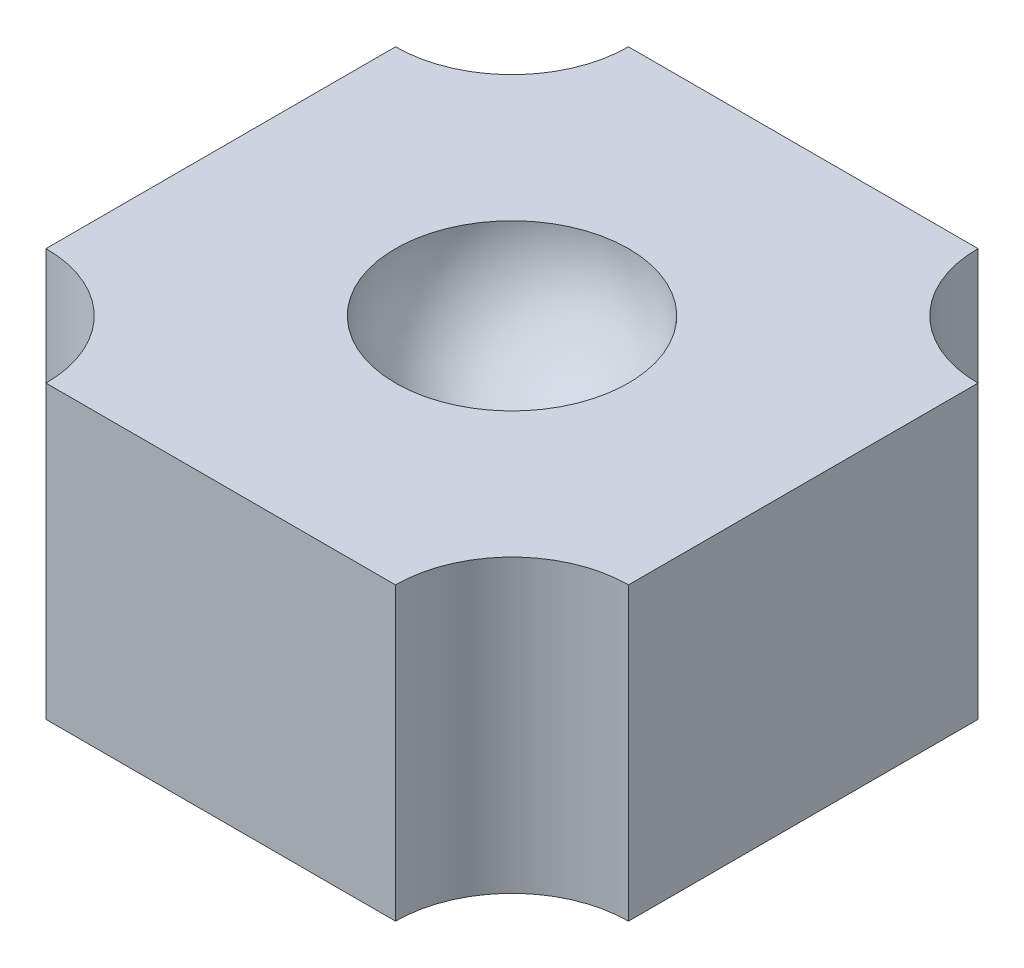
ISO-10303-21;
HEADER;
FILE_DESCRIPTION(('STEP AP214'),'2;1');
FILE_NAME('part.step','',(''),(''),'','','');
FILE_SCHEMA(('AUTOMOTIVE_DESIGN { 1 0 10303 214 1 1 1 1 }'));
ENDSEC;
DATA;
#1=APPLICATION_CONTEXT('core data for automotive mechanical design processes');
#2=APPLICATION_PROTOCOL_DEFINITION('international standard','automotive_design',2000,#1);
#3=PRODUCT_CONTEXT('',#1,'mechanical');
#4=PRODUCT('Part','Part','',(#3));
#5=PRODUCT_RELATED_PRODUCT_CATEGORY('part','',(#4));
#6=PRODUCT_DEFINITION_FORMATION('','',#4);
#7=PRODUCT_DEFINITION_CONTEXT('part definition',#1,'design');
#8=PRODUCT_DEFINITION('design','',#6,#7);
#9=PRODUCT_DEFINITION_SHAPE('','',#8);
#10=(LENGTH_UNIT() NAMED_UNIT(*) SI_UNIT(.MILLI.,.METRE.));
#11=(NAMED_UNIT(*) PLANE_ANGLE_UNIT() SI_UNIT($,.RADIAN.));
#12=(NAMED_UNIT(*) SI_UNIT($,.STERADIAN.) SOLID_ANGLE_UNIT());
#13=UNCERTAINTY_MEASURE_WITH_UNIT(LENGTH_MEASURE(1.E-05),#10,'distance_accuracy_value','');
#14=(GEOMETRIC_REPRESENTATION_CONTEXT(3) GLOBAL_UNCERTAINTY_ASSIGNED_CONTEXT((#13)) GLOBAL_UNIT_ASSIGNED_CONTEXT((#10,
#11,#12)) REPRESENTATION_CONTEXT('',''));
#15=CARTESIAN_POINT('',(0.,0.,0.));
#16=DIRECTION('',(0.,0.,1.));
#17=DIRECTION('',(1.,0.,0.));
#18=AXIS2_PLACEMENT_3D('',#15,#16,#17);
#19=CARTESIAN_POINT('',(25.,25.,-25.));
#20=DIRECTION('',(-1.,0.,0.));
#21=DIRECTION('',(0.,0.,1.));
#22=AXIS2_PLACEMENT_3D('',#19,#20,#21);
#23=PLANE('',#22);
#24=DIRECTION('',(0.,0.,-1.));
#25=VECTOR('',#24,1.);
#26=CARTESIAN_POINT('',(25.,25.,-25.));
#27=LINE('',#26,#25);
#28=CARTESIAN_POINT('',(25.,25.,15.));
#29=VERTEX_POINT('',#28);
#30=CARTESIAN_POINT('',(25.,25.,-15.));
#31=VERTEX_POINT('',#30);
#32=EDGE_CURVE('E304',#29,#31,#27,.T.);
#33=ORIENTED_EDGE('',*,*,#32,.F.);
#34=DIRECTION('',(0.,1.,0.));
#35=VECTOR('',#34,1.);
#36=CARTESIAN_POINT('',(25.,0.,15.));
#37=LINE('',#36,#35);
#38=CARTESIAN_POINT('',(25.,0.,15.));
#39=VERTEX_POINT('',#38);
#40=EDGE_CURVE('E300',#29,#39,#37,.F.);
#41=ORIENTED_EDGE('',*,*,#40,.T.);
#42=DIRECTION('',(0.,0.,-1.));
#43=VECTOR('',#42,1.);
#44=CARTESIAN_POINT('',(25.,0.,-25.));
#45=LINE('',#44,#43);
#46=CARTESIAN_POINT('',(25.,0.,-15.));
#47=VERTEX_POINT('',#46);
#48=EDGE_CURVE('E303',#39,#47,#45,.T.);
#49=ORIENTED_EDGE('',*,*,#48,.T.);
#50=DIRECTION('',(0.,1.,0.));
#51=VECTOR('',#50,1.);
#52=CARTESIAN_POINT('',(25.,0.,-15.));
#53=LINE('',#52,#51);
#54=EDGE_CURVE('E294',#47,#31,#53,.T.);
#55=ORIENTED_EDGE('',*,*,#54,.T.);
#56=EDGE_LOOP('',(#33,#41,#49,#55));
#57=FACE_BOUND('',#56,.T.);
#58=ADVANCED_FACE('F33',(#57),#23,.F.);
#59=CARTESIAN_POINT('',(-25.,25.,-25.));
#60=DIRECTION('',(0.,0.,1.));
#61=DIRECTION('',(1.,0.,0.));
#62=AXIS2_PLACEMENT_3D('',#59,#60,#61);
#63=PLANE('',#62);
#64=DIRECTION('',(-1.,0.,0.));
#65=VECTOR('',#64,1.);
#66=CARTESIAN_POINT('',(-25.,25.,-25.));
#67=LINE('',#66,#65);
#68=CARTESIAN_POINT('',(15.,25.,-25.));
#69=VERTEX_POINT('',#68);
#70=CARTESIAN_POINT('',(-15.,25.,-25.));
#71=VERTEX_POINT('',#70);
#72=EDGE_CURVE('E307',#69,#71,#67,.T.);
#73=ORIENTED_EDGE('',*,*,#72,.F.);
#74=DIRECTION('',(0.,1.,0.));
#75=VECTOR('',#74,1.);
#76=CARTESIAN_POINT('',(15.,0.,-25.));
#77=LINE('',#76,#75);
#78=CARTESIAN_POINT('',(15.,0.,-25.));
#79=VERTEX_POINT('',#78);
#80=EDGE_CURVE('E291',#69,#79,#77,.F.);
#81=ORIENTED_EDGE('',*,*,#80,.T.);
#82=DIRECTION('',(-1.,0.,0.));
#83=VECTOR('',#82,1.);
#84=CARTESIAN_POINT('',(-25.,0.,-25.));
#85=LINE('',#84,#83);
#86=CARTESIAN_POINT('',(-15.,0.,-25.));
#87=VERTEX_POINT('',#86);
#88=EDGE_CURVE('E319',#79,#87,#85,.T.);
#89=ORIENTED_EDGE('',*,*,#88,.T.);
#90=DIRECTION('',(0.,1.,0.));
#91=VECTOR('',#90,1.);
#92=CARTESIAN_POINT('',(-15.,0.,-25.));
#93=LINE('',#92,#91);
#94=EDGE_CURVE('E288',#87,#71,#93,.T.);
#95=ORIENTED_EDGE('',*,*,#94,.T.);
#96=EDGE_LOOP('',(#73,#81,#89,#95));
#97=FACE_BOUND('',#96,.T.);
#98=ADVANCED_FACE('F351',(#97),#63,.F.);
#99=CARTESIAN_POINT('',(-25.,25.,-25.));
#100=DIRECTION('',(1.,0.,0.));
#101=DIRECTION('',(0.,0.,-1.));
#102=AXIS2_PLACEMENT_3D('',#99,#100,#101);
#103=PLANE('',#102);
#104=DIRECTION('',(0.,0.,1.));
#105=VECTOR('',#104,1.);
#106=CARTESIAN_POINT('',(-25.,25.,-25.));
#107=LINE('',#106,#105);
#108=CARTESIAN_POINT('',(-25.,25.,-15.));
#109=VERTEX_POINT('',#108);
#110=CARTESIAN_POINT('',(-25.,25.,15.));
#111=VERTEX_POINT('',#110);
#112=EDGE_CURVE('E311',#109,#111,#107,.T.);
#113=ORIENTED_EDGE('',*,*,#112,.F.);
#114=DIRECTION('',(0.,1.,0.));
#115=VECTOR('',#114,1.);
#116=CARTESIAN_POINT('',(-25.,0.,-15.));
#117=LINE('',#116,#115);
#118=CARTESIAN_POINT('',(-25.,0.,-15.));
#119=VERTEX_POINT('',#118);
#120=EDGE_CURVE('E285',#109,#119,#117,.F.);
#121=ORIENTED_EDGE('',*,*,#120,.T.);
#122=DIRECTION('',(0.,0.,1.));
#123=VECTOR('',#122,1.);
#124=CARTESIAN_POINT('',(-25.,0.,-25.));
#125=LINE('',#124,#123);
#126=CARTESIAN_POINT('',(-25.,0.,15.));
#127=VERTEX_POINT('',#126);
#128=EDGE_CURVE('E322',#119,#127,#125,.T.);
#129=ORIENTED_EDGE('',*,*,#128,.T.);
#130=DIRECTION('',(0.,1.,0.));
#131=VECTOR('',#130,1.);
#132=CARTESIAN_POINT('',(-25.,0.,15.));
#133=LINE('',#132,#131);
#134=EDGE_CURVE('E282',#127,#111,#133,.T.);
#135=ORIENTED_EDGE('',*,*,#134,.T.);
#136=EDGE_LOOP('',(#113,#121,#129,#135));
#137=FACE_BOUND('',#136,.T.);
#138=ADVANCED_FACE('F356',(#137),#103,.F.);
#139=CARTESIAN_POINT('',(-25.,25.,25.));
#140=DIRECTION('',(0.,0.,-1.));
#141=DIRECTION('',(-1.,0.,0.));
#142=AXIS2_PLACEMENT_3D('',#139,#140,#141);
#143=PLANE('',#142);
#144=DIRECTION('',(1.,0.,0.));
#145=VECTOR('',#144,1.);
#146=CARTESIAN_POINT('',(-25.,0.,25.));
#147=LINE('',#146,#145);
#148=CARTESIAN_POINT('',(-15.,0.,25.));
#149=VERTEX_POINT('',#148);
#150=CARTESIAN_POINT('',(15.,0.,25.));
#151=VERTEX_POINT('',#150);
#152=EDGE_CURVE('E308',#149,#151,#147,.T.);
#153=ORIENTED_EDGE('',*,*,#152,.T.);
#154=DIRECTION('',(0.,1.,0.));
#155=VECTOR('',#154,1.);
#156=CARTESIAN_POINT('',(15.,0.,25.));
#157=LINE('',#156,#155);
#158=CARTESIAN_POINT('',(15.,25.,25.));
#159=VERTEX_POINT('',#158);
#160=EDGE_CURVE('E297',#151,#159,#157,.T.);
#161=ORIENTED_EDGE('',*,*,#160,.T.);
#162=DIRECTION('',(1.,0.,0.));
#163=VECTOR('',#162,1.);
#164=CARTESIAN_POINT('',(-25.,25.,25.));
#165=LINE('',#164,#163);
#166=CARTESIAN_POINT('',(-15.,25.,25.));
#167=VERTEX_POINT('',#166);
#168=EDGE_CURVE('E314',#167,#159,#165,.T.);
#169=ORIENTED_EDGE('',*,*,#168,.F.);
#170=DIRECTION('',(0.,1.,0.));
#171=VECTOR('',#170,1.);
#172=CARTESIAN_POINT('',(-15.,0.,25.));
#173=LINE('',#172,#171);
#174=EDGE_CURVE('E278',#167,#149,#173,.F.);
#175=ORIENTED_EDGE('',*,*,#174,.T.);
#176=EDGE_LOOP('',(#153,#161,#169,#175));
#177=FACE_BOUND('',#176,.T.);
#178=ADVANCED_FACE('F366',(#177),#143,.F.);
#179=CARTESIAN_POINT('',(0.,25.,0.));
#180=DIRECTION('',(0.,1.,0.));
#181=DIRECTION('',(0.,0.,1.));
#182=AXIS2_PLACEMENT_3D('',#179,#180,#181);
#183=PLANE('',#182);
#184=CARTESIAN_POINT('',(0.,25.,0.));
#185=DIRECTION('',(0.,1.,0.));
#186=DIRECTION('',(0.,0.,1.));
#187=AXIS2_PLACEMENT_3D('',#184,#185,#186);
#188=CIRCLE('',#187,10.);
#189=CARTESIAN_POINT('',(0.,25.,10.));
#190=VERTEX_POINT('',#189);
#191=EDGE_CURVE('E256',#190,#190,#188,.F.);
#192=ORIENTED_EDGE('',*,*,#191,.T.);
#193=EDGE_LOOP('',(#192));
#194=FACE_BOUND('',#193,.T.);
#195=CARTESIAN_POINT('',(25.,25.,25.));
#196=DIRECTION('',(0.,1.,0.));
#197=DIRECTION('',(0.,0.,1.));
#198=AXIS2_PLACEMENT_3D('',#195,#196,#197);
#199=CIRCLE('',#198,10.);
#200=EDGE_CURVE('E273',#29,#159,#199,.T.);
#201=ORIENTED_EDGE('',*,*,#200,.F.);
#202=ORIENTED_EDGE('',*,*,#32,.T.);
#203=CARTESIAN_POINT('',(25.,25.,-25.));
#204=DIRECTION('',(0.,1.,0.));
#205=DIRECTION('',(0.,0.,1.));
#206=AXIS2_PLACEMENT_3D('',#203,#204,#205);
#207=CIRCLE('',#206,10.);
#208=EDGE_CURVE('E268',#69,#31,#207,.T.);
#209=ORIENTED_EDGE('',*,*,#208,.F.);
#210=ORIENTED_EDGE('',*,*,#72,.T.);
#211=CARTESIAN_POINT('',(-25.,25.,-25.));
#212=DIRECTION('',(0.,1.,0.));
#213=DIRECTION('',(0.,0.,1.));
#214=AXIS2_PLACEMENT_3D('',#211,#212,#213);
#215=CIRCLE('',#214,10.);
#216=EDGE_CURVE('E266',#109,#71,#215,.T.);
#217=ORIENTED_EDGE('',*,*,#216,.F.);
#218=ORIENTED_EDGE('',*,*,#112,.T.);
#219=CARTESIAN_POINT('',(-25.,25.,25.));
#220=DIRECTION('',(0.,1.,0.));
#221=DIRECTION('',(0.,0.,1.));
#222=AXIS2_PLACEMENT_3D('',#219,#220,#221);
#223=CIRCLE('',#222,10.);
#224=EDGE_CURVE('E265',#167,#111,#223,.T.);
#225=ORIENTED_EDGE('',*,*,#224,.F.);
#226=ORIENTED_EDGE('',*,*,#168,.T.);
#227=EDGE_LOOP('',(#201,#202,#209,#210,#217,#218,#225,#226));
#228=FACE_BOUND('',#227,.T.);
#229=ADVANCED_FACE('F331',(#194,#228),#183,.T.);
#230=CARTESIAN_POINT('',(0.,0.,0.));
#231=DIRECTION('',(0.,1.,0.));
#232=DIRECTION('',(0.,0.,1.));
#233=AXIS2_PLACEMENT_3D('',#230,#231,#232);
#234=PLANE('',#233);
#235=DIRECTION('',(0.,0.,1.));
#236=VECTOR('',#235,1.);
#237=CARTESIAN_POINT('',(2.5,0.,0.));
#238=LINE('',#237,#236);
#239=CARTESIAN_POINT('',(2.5,0.,0.));
#240=VERTEX_POINT('',#239);
#241=CARTESIAN_POINT('',(2.5,0.,7.66987298107781));
#242=VERTEX_POINT('',#241);
#243=EDGE_CURVE('E247',#240,#242,#238,.T.);
#244=ORIENTED_EDGE('',*,*,#243,.F.);
#245=CARTESIAN_POINT('',(0.,0.,0.));
#246=DIRECTION('',(0.,-1.,0.));
#247=DIRECTION('',(0.,0.,-1.));
#248=AXIS2_PLACEMENT_3D('',#245,#246,#247);
#249=CIRCLE('',#248,2.5);
#250=CARTESIAN_POINT('',(-2.5,0.,0.));
#251=VERTEX_POINT('',#250);
#252=EDGE_CURVE('E245',#251,#240,#249,.T.);
#253=ORIENTED_EDGE('',*,*,#252,.F.);
#254=DIRECTION('',(0.,0.,-1.));
#255=VECTOR('',#254,1.);
#256=CARTESIAN_POINT('',(-2.5,0.,0.));
#257=LINE('',#256,#255);
#258=CARTESIAN_POINT('',(-2.5,0.,7.66987298107781));
#259=VERTEX_POINT('',#258);
#260=EDGE_CURVE('E244',#259,#251,#257,.T.);
#261=ORIENTED_EDGE('',*,*,#260,.F.);
#262=CARTESIAN_POINT('',(0.,0.,12.));
#263=DIRECTION('',(0.,-1.,0.));
#264=DIRECTION('',(0.,0.,-1.));
#265=AXIS2_PLACEMENT_3D('',#262,#263,#264);
#266=CIRCLE('',#265,5.);
#267=EDGE_CURVE('E249',#242,#259,#266,.T.);
#268=ORIENTED_EDGE('',*,*,#267,.F.);
#269=EDGE_LOOP('',(#244,#253,#261,#268));
#270=FACE_BOUND('',#269,.T.);
#271=ORIENTED_EDGE('',*,*,#48,.F.);
#272=CARTESIAN_POINT('',(25.,0.,25.));
#273=DIRECTION('',(0.,1.,0.));
#274=DIRECTION('',(0.,0.,1.));
#275=AXIS2_PLACEMENT_3D('',#272,#273,#274);
#276=CIRCLE('',#275,10.);
#277=EDGE_CURVE('E270',#39,#151,#276,.T.);
#278=ORIENTED_EDGE('',*,*,#277,.T.);
#279=ORIENTED_EDGE('',*,*,#152,.F.);
#280=CARTESIAN_POINT('',(-25.,0.,25.));
#281=DIRECTION('',(0.,1.,0.));
#282=DIRECTION('',(0.,0.,1.));
#283=AXIS2_PLACEMENT_3D('',#280,#281,#282);
#284=CIRCLE('',#283,10.);
#285=EDGE_CURVE('E275',#149,#127,#284,.T.);
#286=ORIENTED_EDGE('',*,*,#285,.T.);
#287=ORIENTED_EDGE('',*,*,#128,.F.);
#288=CARTESIAN_POINT('',(-25.,0.,-25.));
#289=DIRECTION('',(0.,1.,0.));
#290=DIRECTION('',(0.,0.,1.));
#291=AXIS2_PLACEMENT_3D('',#288,#289,#290);
#292=CIRCLE('',#291,10.);
#293=EDGE_CURVE('E262',#119,#87,#292,.T.);
#294=ORIENTED_EDGE('',*,*,#293,.T.);
#295=ORIENTED_EDGE('',*,*,#88,.F.);
#296=CARTESIAN_POINT('',(25.,0.,-25.));
#297=DIRECTION('',(0.,1.,0.));
#298=DIRECTION('',(0.,0.,1.));
#299=AXIS2_PLACEMENT_3D('',#296,#297,#298);
#300=CIRCLE('',#299,10.);
#301=EDGE_CURVE('E40',#79,#47,#300,.T.);
#302=ORIENTED_EDGE('',*,*,#301,.T.);
#303=EDGE_LOOP('',(#271,#278,#279,#286,#287,#294,#295,#302));
#304=FACE_BOUND('',#303,.T.);
#305=ADVANCED_FACE('F369',(#270,#304),#234,.F.);
#306=CARTESIAN_POINT('',(-25.,0.,25.));
#307=DIRECTION('',(0.,1.,0.));
#308=DIRECTION('',(0.,0.,1.));
#309=AXIS2_PLACEMENT_3D('',#306,#307,#308);
#310=CYLINDRICAL_SURFACE('',#309,10.);
#311=ORIENTED_EDGE('',*,*,#285,.F.);
#312=ORIENTED_EDGE('',*,*,#174,.F.);
#313=ORIENTED_EDGE('',*,*,#224,.T.);
#314=ORIENTED_EDGE('',*,*,#134,.F.);
#315=EDGE_LOOP('',(#311,#312,#313,#314));
#316=FACE_BOUND('',#315,.T.);
#317=ADVANCED_FACE('F378',(#316),#310,.F.);
#318=CARTESIAN_POINT('',(-25.,0.,-25.));
#319=DIRECTION('',(0.,1.,0.));
#320=DIRECTION('',(0.,0.,1.));
#321=AXIS2_PLACEMENT_3D('',#318,#319,#320);
#322=CYLINDRICAL_SURFACE('',#321,10.);
#323=ORIENTED_EDGE('',*,*,#293,.F.);
#324=ORIENTED_EDGE('',*,*,#120,.F.);
#325=ORIENTED_EDGE('',*,*,#216,.T.);
#326=ORIENTED_EDGE('',*,*,#94,.F.);
#327=EDGE_LOOP('',(#323,#324,#325,#326));
#328=FACE_BOUND('',#327,.T.);
#329=ADVANCED_FACE('F380',(#328),#322,.F.);
#330=CARTESIAN_POINT('',(25.,0.,-25.));
#331=DIRECTION('',(0.,1.,0.));
#332=DIRECTION('',(0.,0.,1.));
#333=AXIS2_PLACEMENT_3D('',#330,#331,#332);
#334=CYLINDRICAL_SURFACE('',#333,10.);
#335=ORIENTED_EDGE('',*,*,#301,.F.);
#336=ORIENTED_EDGE('',*,*,#80,.F.);
#337=ORIENTED_EDGE('',*,*,#208,.T.);
#338=ORIENTED_EDGE('',*,*,#54,.F.);
#339=EDGE_LOOP('',(#335,#336,#337,#338));
#340=FACE_BOUND('',#339,.T.);
#341=ADVANCED_FACE('F346',(#340),#334,.F.);
#342=CARTESIAN_POINT('',(25.,0.,25.));
#343=DIRECTION('',(0.,1.,0.));
#344=DIRECTION('',(0.,0.,1.));
#345=AXIS2_PLACEMENT_3D('',#342,#343,#344);
#346=CYLINDRICAL_SURFACE('',#345,10.);
#347=ORIENTED_EDGE('',*,*,#200,.T.);
#348=ORIENTED_EDGE('',*,*,#160,.F.);
#349=ORIENTED_EDGE('',*,*,#277,.F.);
#350=ORIENTED_EDGE('',*,*,#40,.F.);
#351=EDGE_LOOP('',(#347,#348,#349,#350));
#352=FACE_BOUND('',#351,.T.);
#353=ADVANCED_FACE('F337',(#352),#346,.F.);
#354=CARTESIAN_POINT('',(0.,25.,0.));
#355=DIRECTION('',(0.,0.,1.));
#356=DIRECTION('',(1.,0.,0.));
#357=AXIS2_PLACEMENT_3D('',#354,#355,#356);
#358=SPHERICAL_SURFACE('',#357,10.);
#359=CARTESIAN_POINT('',(0.,25.,0.));
#360=DIRECTION('',(0.,1.,0.));
#361=DIRECTION('',(0.,0.,1.));
#362=AXIS2_PLACEMENT_3D('',#359,#360,#361);
#363=SPHERICAL_SURFACE('',#362,10.);
#364=ORIENTED_EDGE('',*,*,#191,.F.);
#365=EDGE_LOOP('',(#364));
#366=FACE_BOUND('',#365,.T.);
#367=ADVANCED_FACE('F334',(#366),#363,.F.);
#368=CARTESIAN_POINT('',(0.,8.6,0.));
#369=DIRECTION('',(0.,-1.,0.));
#370=DIRECTION('',(0.,0.,-1.));
#371=AXIS2_PLACEMENT_3D('',#368,#369,#370);
#372=CYLINDRICAL_SURFACE('',#371,2.5);
#373=DIRECTION('',(0.,-1.,0.));
#374=VECTOR('',#373,1.);
#375=CARTESIAN_POINT('',(2.5,8.6,0.));
#376=LINE('',#375,#374);
#377=CARTESIAN_POINT('',(2.5,4.9,0.));
#378=VERTEX_POINT('',#377);
#379=EDGE_CURVE('E54',#378,#240,#376,.T.);
#380=ORIENTED_EDGE('',*,*,#379,.F.);
#381=CARTESIAN_POINT('',(0.,4.9,0.));
#382=DIRECTION('',(0.,-1.,0.));
#383=DIRECTION('',(1.,0.,0.));
#384=AXIS2_PLACEMENT_3D('',#381,#382,#383);
#385=CIRCLE('',#384,2.5);
#386=CARTESIAN_POINT('',(-2.5,4.9,0.));
#387=VERTEX_POINT('',#386);
#388=EDGE_CURVE('E232',#378,#387,#385,.F.);
#389=ORIENTED_EDGE('',*,*,#388,.T.);
#390=DIRECTION('',(0.,-1.,0.));
#391=VECTOR('',#390,1.);
#392=CARTESIAN_POINT('',(-2.5,8.6,0.));
#393=LINE('',#392,#391);
#394=EDGE_CURVE('E254',#387,#251,#393,.T.);
#395=ORIENTED_EDGE('',*,*,#394,.T.);
#396=ORIENTED_EDGE('',*,*,#252,.T.);
#397=EDGE_LOOP('',(#380,#389,#395,#396));
#398=FACE_BOUND('',#397,.T.);
#399=ADVANCED_FACE('F336',(#398),#372,.F.);
#400=CARTESIAN_POINT('',(-2.5,8.6,0.));
#401=DIRECTION('',(-1.,0.,0.));
#402=DIRECTION('',(0.,0.,1.));
#403=AXIS2_PLACEMENT_3D('',#400,#401,#402);
#404=PLANE('',#403);
#405=ORIENTED_EDGE('',*,*,#394,.F.);
#406=DIRECTION('',(0.,0.,1.));
#407=VECTOR('',#406,1.);
#408=CARTESIAN_POINT('',(-2.5,4.9,0.));
#409=LINE('',#408,#407);
#410=CARTESIAN_POINT('',(-2.5,4.9,7.66987298107781));
#411=VERTEX_POINT('',#410);
#412=EDGE_CURVE('E237',#387,#411,#409,.T.);
#413=ORIENTED_EDGE('',*,*,#412,.T.);
#414=DIRECTION('',(0.,-1.,0.));
#415=VECTOR('',#414,1.);
#416=CARTESIAN_POINT('',(-2.5,8.6,7.66987298107781));
#417=LINE('',#416,#415);
#418=EDGE_CURVE('E257',#411,#259,#417,.T.);
#419=ORIENTED_EDGE('',*,*,#418,.T.);
#420=ORIENTED_EDGE('',*,*,#260,.T.);
#421=EDGE_LOOP('',(#405,#413,#419,#420));
#422=FACE_BOUND('',#421,.T.);
#423=ADVANCED_FACE('F343',(#422),#404,.F.);
#424=CARTESIAN_POINT('',(0.,8.6,12.));
#425=DIRECTION('',(0.,-1.,0.));
#426=DIRECTION('',(0.,0.,-1.));
#427=AXIS2_PLACEMENT_3D('',#424,#425,#426);
#428=CYLINDRICAL_SURFACE('',#427,5.);
#429=ORIENTED_EDGE('',*,*,#418,.F.);
#430=CARTESIAN_POINT('',(0.,4.9,12.));
#431=DIRECTION('',(0.,-1.,0.));
#432=DIRECTION('',(1.,0.,0.));
#433=AXIS2_PLACEMENT_3D('',#430,#431,#432);
#434=CIRCLE('',#433,5.);
#435=CARTESIAN_POINT('',(-4.,4.9,9.));
#436=VERTEX_POINT('',#435);
#437=EDGE_CURVE('E234',#411,#436,#434,.F.);
#438=ORIENTED_EDGE('',*,*,#437,.T.);
#439=DIRECTION('',(0.,-1.,0.));
#440=VECTOR('',#439,1.);
#441=CARTESIAN_POINT('',(-4.,8.6,9.));
#442=LINE('',#441,#440);
#443=CARTESIAN_POINT('',(-4.,8.6,9.));
#444=VERTEX_POINT('',#443);
#445=EDGE_CURVE('E228',#436,#444,#442,.F.);
#446=ORIENTED_EDGE('',*,*,#445,.T.);
#447=CARTESIAN_POINT('',(0.,8.6,12.));
#448=DIRECTION('',(0.,-1.,0.));
#449=DIRECTION('',(0.,0.,-1.));
#450=AXIS2_PLACEMENT_3D('',#447,#448,#449);
#451=CIRCLE('',#450,5.);
#452=CARTESIAN_POINT('',(-4.,8.6,15.));
#453=VERTEX_POINT('',#452);
#454=EDGE_CURVE('E240',#453,#444,#451,.T.);
#455=ORIENTED_EDGE('',*,*,#454,.F.);
#456=DIRECTION('',(0.,-1.,0.));
#457=VECTOR('',#456,1.);
#458=CARTESIAN_POINT('',(-4.,8.6,15.));
#459=LINE('',#458,#457);
#460=CARTESIAN_POINT('',(-4.,4.9,15.));
#461=VERTEX_POINT('',#460);
#462=EDGE_CURVE('E225',#453,#461,#459,.T.);
#463=ORIENTED_EDGE('',*,*,#462,.T.);
#464=CARTESIAN_POINT('',(0.,4.9,17.));
#465=VERTEX_POINT('',#464);
#466=EDGE_CURVE('E233',#461,#465,#434,.F.);
#467=ORIENTED_EDGE('',*,*,#466,.T.);
#468=CARTESIAN_POINT('',(4.,4.9,15.));
#469=VERTEX_POINT('',#468);
#470=EDGE_CURVE('E558',#465,#469,#434,.F.);
#471=ORIENTED_EDGE('',*,*,#470,.T.);
#472=DIRECTION('',(0.,-1.,0.));
#473=VECTOR('',#472,1.);
#474=CARTESIAN_POINT('',(4.,8.6,15.));
#475=LINE('',#474,#473);
#476=CARTESIAN_POINT('',(4.,8.6,15.));
#477=VERTEX_POINT('',#476);
#478=EDGE_CURVE('E223',#469,#477,#475,.F.);
#479=ORIENTED_EDGE('',*,*,#478,.T.);
#480=CARTESIAN_POINT('',(4.,8.6,9.));
#481=VERTEX_POINT('',#480);
#482=EDGE_CURVE('E243',#481,#477,#451,.T.);
#483=ORIENTED_EDGE('',*,*,#482,.F.);
#484=DIRECTION('',(0.,-1.,0.));
#485=VECTOR('',#484,1.);
#486=CARTESIAN_POINT('',(4.,8.6,9.));
#487=LINE('',#486,#485);
#488=CARTESIAN_POINT('',(4.,4.9,9.));
#489=VERTEX_POINT('',#488);
#490=EDGE_CURVE('E216',#481,#489,#487,.T.);
#491=ORIENTED_EDGE('',*,*,#490,.T.);
#492=CARTESIAN_POINT('',(2.5,4.9,7.66987298107781));
#493=VERTEX_POINT('',#492);
#494=EDGE_CURVE('E180',#489,#493,#434,.F.);
#495=ORIENTED_EDGE('',*,*,#494,.T.);
#496=DIRECTION('',(0.,-1.,0.));
#497=VECTOR('',#496,1.);
#498=CARTESIAN_POINT('',(2.5,8.6,7.66987298107781));
#499=LINE('',#498,#497);
#500=EDGE_CURVE('E259',#493,#242,#499,.T.);
#501=ORIENTED_EDGE('',*,*,#500,.T.);
#502=ORIENTED_EDGE('',*,*,#267,.T.);
#503=EDGE_LOOP('',(#429,#438,#446,#455,#463,#467,#471,#479,#483,#491,#495,#501,#502));
#504=FACE_BOUND('',#503,.T.);
#505=ADVANCED_FACE('F430',(#504),#428,.F.);
#506=CARTESIAN_POINT('',(2.5,8.6,0.));
#507=DIRECTION('',(1.,0.,0.));
#508=DIRECTION('',(0.,0.,-1.));
#509=AXIS2_PLACEMENT_3D('',#506,#507,#508);
#510=PLANE('',#509);
#511=ORIENTED_EDGE('',*,*,#500,.F.);
#512=DIRECTION('',(0.,0.,-1.));
#513=VECTOR('',#512,1.);
#514=CARTESIAN_POINT('',(2.5,4.9,0.));
#515=LINE('',#514,#513);
#516=EDGE_CURVE('E11',#493,#378,#515,.T.);
#517=ORIENTED_EDGE('',*,*,#516,.T.);
#518=ORIENTED_EDGE('',*,*,#379,.T.);
#519=ORIENTED_EDGE('',*,*,#243,.T.);
#520=EDGE_LOOP('',(#511,#517,#518,#519));
#521=FACE_BOUND('',#520,.T.);
#522=ADVANCED_FACE('F440',(#521),#510,.F.);
#523=CARTESIAN_POINT('',(0.,8.6,0.));
#524=DIRECTION('',(0.,-1.,0.));
#525=DIRECTION('',(0.,0.,-1.));
#526=AXIS2_PLACEMENT_3D('',#523,#524,#525);
#527=PLANE('',#526);
#528=DIRECTION('',(0.,0.,1.));
#529=VECTOR('',#528,1.);
#530=CARTESIAN_POINT('',(4.,8.6,-7.));
#531=LINE('',#530,#529);
#532=CARTESIAN_POINT('',(4.,8.6,-7.));
#533=VERTEX_POINT('',#532);
#534=EDGE_CURVE('E189',#533,#481,#531,.T.);
#535=ORIENTED_EDGE('',*,*,#534,.T.);
#536=ORIENTED_EDGE('',*,*,#482,.T.);
#537=CARTESIAN_POINT('',(4.,8.6,17.));
#538=VERTEX_POINT('',#537);
#539=EDGE_CURVE('E47',#477,#538,#531,.T.);
#540=ORIENTED_EDGE('',*,*,#539,.T.);
#541=DIRECTION('',(-1.,0.,0.));
#542=VECTOR('',#541,1.);
#543=CARTESIAN_POINT('',(-4.,8.6,17.));
#544=LINE('',#543,#542);
#545=CARTESIAN_POINT('',(-4.,8.6,17.));
#546=VERTEX_POINT('',#545);
#547=EDGE_CURVE('E209',#538,#546,#544,.T.);
#548=ORIENTED_EDGE('',*,*,#547,.T.);
#549=DIRECTION('',(0.,0.,1.));
#550=VECTOR('',#549,1.);
#551=CARTESIAN_POINT('',(-4.,8.6,-7.));
#552=LINE('',#551,#550);
#553=EDGE_CURVE('E220',#453,#546,#552,.T.);
#554=ORIENTED_EDGE('',*,*,#553,.F.);
#555=ORIENTED_EDGE('',*,*,#454,.T.);
#556=CARTESIAN_POINT('',(-4.,8.6,-7.));
#557=VERTEX_POINT('',#556);
#558=EDGE_CURVE('E218',#557,#444,#552,.T.);
#559=ORIENTED_EDGE('',*,*,#558,.F.);
#560=DIRECTION('',(-1.,0.,0.));
#561=VECTOR('',#560,1.);
#562=CARTESIAN_POINT('',(-4.,8.6,-7.));
#563=LINE('',#562,#561);
#564=EDGE_CURVE('E193',#533,#557,#563,.T.);
#565=ORIENTED_EDGE('',*,*,#564,.F.);
#566=EDGE_LOOP('',(#535,#536,#540,#548,#554,#555,#559,#565));
#567=FACE_BOUND('',#566,.T.);
#568=ADVANCED_FACE('F450',(#567),#527,.T.);
#569=CARTESIAN_POINT('',(0.,0.,-7.));
#570=DIRECTION('',(0.,0.,-1.));
#571=DIRECTION('',(-1.,0.,0.));
#572=AXIS2_PLACEMENT_3D('',#569,#570,#571);
#573=PLANE('',#572);
#574=DIRECTION('',(1.,0.,0.));
#575=VECTOR('',#574,1.);
#576=CARTESIAN_POINT('',(0.,4.9,-7.));
#577=LINE('',#576,#575);
#578=CARTESIAN_POINT('',(-4.,4.9,-7.));
#579=VERTEX_POINT('',#578);
#580=CARTESIAN_POINT('',(4.,4.9,-7.));
#581=VERTEX_POINT('',#580);
#582=EDGE_CURVE('E177',#579,#581,#577,.T.);
#583=ORIENTED_EDGE('',*,*,#582,.T.);
#584=DIRECTION('',(0.,1.,0.));
#585=VECTOR('',#584,1.);
#586=CARTESIAN_POINT('',(4.,8.6,-7.));
#587=LINE('',#586,#585);
#588=EDGE_CURVE('E186',#581,#533,#587,.T.);
#589=ORIENTED_EDGE('',*,*,#588,.T.);
#590=ORIENTED_EDGE('',*,*,#564,.T.);
#591=DIRECTION('',(0.,-1.,0.));
#592=VECTOR('',#591,1.);
#593=CARTESIAN_POINT('',(-4.,4.9,-7.));
#594=LINE('',#593,#592);
#595=EDGE_CURVE('E198',#557,#579,#594,.T.);
#596=ORIENTED_EDGE('',*,*,#595,.T.);
#597=EDGE_LOOP('',(#583,#589,#590,#596));
#598=FACE_BOUND('',#597,.T.);
#599=ADVANCED_FACE('F196',(#598),#573,.F.);
#600=CARTESIAN_POINT('',(0.,4.9,-7.));
#601=DIRECTION('',(0.,-1.,0.));
#602=DIRECTION('',(1.,0.,0.));
#603=AXIS2_PLACEMENT_3D('',#600,#601,#602);
#604=PLANE('',#603);
#605=ORIENTED_EDGE('',*,*,#412,.F.);
#606=ORIENTED_EDGE('',*,*,#388,.F.);
#607=ORIENTED_EDGE('',*,*,#516,.F.);
#608=ORIENTED_EDGE('',*,*,#494,.F.);
#609=DIRECTION('',(0.,0.,1.));
#610=VECTOR('',#609,1.);
#611=CARTESIAN_POINT('',(4.,4.9,-7.));
#612=LINE('',#611,#610);
#613=EDGE_CURVE('E172',#581,#489,#612,.T.);
#614=ORIENTED_EDGE('',*,*,#613,.F.);
#615=ORIENTED_EDGE('',*,*,#582,.F.);
#616=DIRECTION('',(0.,0.,1.));
#617=VECTOR('',#616,1.);
#618=CARTESIAN_POINT('',(-4.,4.9,-7.));
#619=LINE('',#618,#617);
#620=EDGE_CURVE('E214',#579,#436,#619,.T.);
#621=ORIENTED_EDGE('',*,*,#620,.T.);
#622=ORIENTED_EDGE('',*,*,#437,.F.);
#623=EDGE_LOOP('',(#605,#606,#607,#608,#614,#615,#621,#622));
#624=FACE_BOUND('',#623,.T.);
#625=ADVANCED_FACE('F174',(#624),#604,.F.);
#626=CARTESIAN_POINT('',(4.,8.6,-7.));
#627=DIRECTION('',(1.,0.,0.));
#628=DIRECTION('',(0.,1.,0.));
#629=AXIS2_PLACEMENT_3D('',#626,#627,#628);
#630=PLANE('',#629);
#631=ORIENTED_EDGE('',*,*,#534,.F.);
#632=ORIENTED_EDGE('',*,*,#588,.F.);
#633=ORIENTED_EDGE('',*,*,#613,.T.);
#634=ORIENTED_EDGE('',*,*,#490,.F.);
#635=EDGE_LOOP('',(#631,#632,#633,#634));
#636=FACE_BOUND('',#635,.T.);
#637=ADVANCED_FACE('F187',(#636),#630,.F.);
#638=CARTESIAN_POINT('',(-4.,4.9,-7.));
#639=DIRECTION('',(-1.,0.,0.));
#640=DIRECTION('',(0.,0.,1.));
#641=AXIS2_PLACEMENT_3D('',#638,#639,#640);
#642=PLANE('',#641);
#643=ORIENTED_EDGE('',*,*,#620,.F.);
#644=ORIENTED_EDGE('',*,*,#595,.F.);
#645=ORIENTED_EDGE('',*,*,#558,.T.);
#646=ORIENTED_EDGE('',*,*,#445,.F.);
#647=EDGE_LOOP('',(#643,#644,#645,#646));
#648=FACE_BOUND('',#647,.T.);
#649=ADVANCED_FACE('F489',(#648),#642,.F.);
#650=CARTESIAN_POINT('',(-4.,4.9,17.));
#651=VERTEX_POINT('',#650);
#652=EDGE_CURVE('E217',#461,#651,#619,.T.);
#653=ORIENTED_EDGE('',*,*,#652,.T.);
#654=DIRECTION('',(1.,0.,0.));
#655=VECTOR('',#654,1.);
#656=CARTESIAN_POINT('',(0.,4.9,17.));
#657=LINE('',#656,#655);
#658=EDGE_CURVE('E199',#651,#465,#657,.T.);
#659=ORIENTED_EDGE('',*,*,#658,.T.);
#660=ORIENTED_EDGE('',*,*,#466,.F.);
#661=EDGE_LOOP('',(#653,#659,#660));
#662=FACE_BOUND('',#661,.T.);
#663=ADVANCED_FACE('F480',(#662),#604,.F.);
#664=CARTESIAN_POINT('',(4.,4.9,17.));
#665=VERTEX_POINT('',#664);
#666=EDGE_CURVE('E202',#465,#665,#657,.T.);
#667=ORIENTED_EDGE('',*,*,#666,.T.);
#668=EDGE_CURVE('E183',#469,#665,#612,.T.);
#669=ORIENTED_EDGE('',*,*,#668,.F.);
#670=ORIENTED_EDGE('',*,*,#470,.F.);
#671=EDGE_LOOP('',(#667,#669,#670));
#672=FACE_BOUND('',#671,.T.);
#673=ADVANCED_FACE('F481',(#672),#604,.F.);
#674=ORIENTED_EDGE('',*,*,#553,.T.);
#675=DIRECTION('',(0.,-1.,0.));
#676=VECTOR('',#675,1.);
#677=CARTESIAN_POINT('',(-4.,4.9,17.));
#678=LINE('',#677,#676);
#679=EDGE_CURVE('E211',#546,#651,#678,.T.);
#680=ORIENTED_EDGE('',*,*,#679,.T.);
#681=ORIENTED_EDGE('',*,*,#652,.F.);
#682=ORIENTED_EDGE('',*,*,#462,.F.);
#683=EDGE_LOOP('',(#674,#680,#681,#682));
#684=FACE_BOUND('',#683,.T.);
#685=ADVANCED_FACE('F501',(#684),#642,.F.);
#686=ORIENTED_EDGE('',*,*,#668,.T.);
#687=DIRECTION('',(0.,1.,0.));
#688=VECTOR('',#687,1.);
#689=CARTESIAN_POINT('',(4.,8.6,17.));
#690=LINE('',#689,#688);
#691=EDGE_CURVE('E207',#665,#538,#690,.T.);
#692=ORIENTED_EDGE('',*,*,#691,.T.);
#693=ORIENTED_EDGE('',*,*,#539,.F.);
#694=ORIENTED_EDGE('',*,*,#478,.F.);
#695=EDGE_LOOP('',(#686,#692,#693,#694));
#696=FACE_BOUND('',#695,.T.);
#697=ADVANCED_FACE('F491',(#696),#630,.F.);
#698=CARTESIAN_POINT('',(0.,0.,17.));
#699=DIRECTION('',(0.,0.,-1.));
#700=DIRECTION('',(-1.,0.,0.));
#701=AXIS2_PLACEMENT_3D('',#698,#699,#700);
#702=PLANE('',#701);
#703=ORIENTED_EDGE('',*,*,#666,.F.);
#704=ORIENTED_EDGE('',*,*,#658,.F.);
#705=ORIENTED_EDGE('',*,*,#679,.F.);
#706=ORIENTED_EDGE('',*,*,#547,.F.);
#707=ORIENTED_EDGE('',*,*,#691,.F.);
#708=EDGE_LOOP('',(#703,#704,#705,#706,#707));
#709=FACE_BOUND('',#708,.T.);
#710=ADVANCED_FACE('F535',(#709),#702,.T.);
#711=CLOSED_SHELL('',(#58,#98,#138,#178,#229,#305,#317,#329,#341,#353,#367,#399,#423,#505,#522,
#568,#599,#625,#637,#649,#663,#673,#685,#697,#710));
#712=MANIFOLD_SOLID_BREP('B2',#711);
#713=ADVANCED_BREP_SHAPE_REPRESENTATION('',(#18,#712),#14);
#714=SHAPE_DEFINITION_REPRESENTATION(#9,#713);
ENDSEC;
END-ISO-10303-21;
